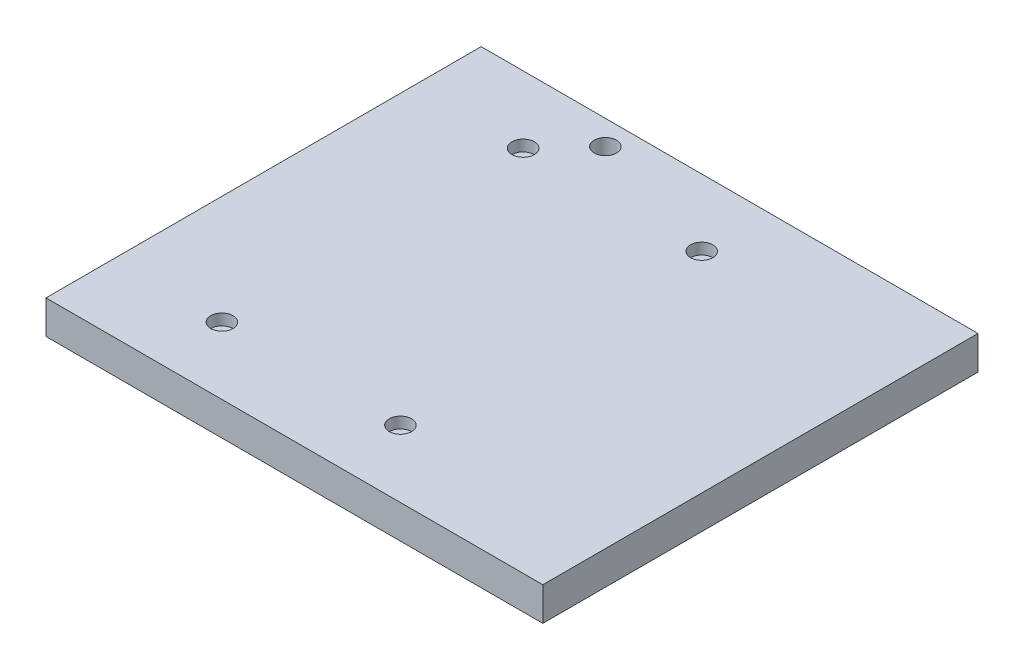
ISO-10303-21;
HEADER;
FILE_DESCRIPTION(('STEP AP214'),'2;1');
FILE_NAME('part.step','',(''),(''),'','','');
FILE_SCHEMA(('AUTOMOTIVE_DESIGN { 1 0 10303 214 1 1 1 1 }'));
ENDSEC;
DATA;
#1=APPLICATION_CONTEXT('core data for automotive mechanical design processes');
#2=APPLICATION_PROTOCOL_DEFINITION('international standard','automotive_design',2000,#1);
#3=PRODUCT_CONTEXT('',#1,'mechanical');
#4=PRODUCT('Part','Part','',(#3));
#5=PRODUCT_RELATED_PRODUCT_CATEGORY('part','',(#4));
#6=PRODUCT_DEFINITION_FORMATION('','',#4);
#7=PRODUCT_DEFINITION_CONTEXT('part definition',#1,'design');
#8=PRODUCT_DEFINITION('design','',#6,#7);
#9=PRODUCT_DEFINITION_SHAPE('','',#8);
#10=(LENGTH_UNIT() NAMED_UNIT(*) SI_UNIT(.MILLI.,.METRE.));
#11=(NAMED_UNIT(*) PLANE_ANGLE_UNIT() SI_UNIT($,.RADIAN.));
#12=(NAMED_UNIT(*) SI_UNIT($,.STERADIAN.) SOLID_ANGLE_UNIT());
#13=UNCERTAINTY_MEASURE_WITH_UNIT(LENGTH_MEASURE(1.E-05),#10,'distance_accuracy_value','');
#14=(GEOMETRIC_REPRESENTATION_CONTEXT(3) GLOBAL_UNCERTAINTY_ASSIGNED_CONTEXT((#13)) GLOBAL_UNIT_ASSIGNED_CONTEXT((#10,
#11,#12)) REPRESENTATION_CONTEXT('',''));
#15=CARTESIAN_POINT('',(0.,0.,0.));
#16=DIRECTION('',(0.,0.,1.));
#17=DIRECTION('',(1.,0.,0.));
#18=AXIS2_PLACEMENT_3D('',#15,#16,#17);
#19=CARTESIAN_POINT('',(0.,30.,0.));
#20=DIRECTION('',(1.,0.,0.));
#21=DIRECTION('',(0.,0.,-1.));
#22=AXIS2_PLACEMENT_3D('',#19,#20,#21);
#23=PLANE('',#22);
#24=DIRECTION('',(0.,0.,1.));
#25=VECTOR('',#24,1.);
#26=CARTESIAN_POINT('',(0.,0.,0.));
#27=LINE('',#26,#25);
#28=CARTESIAN_POINT('',(0.,0.,0.));
#29=VERTEX_POINT('',#28);
#30=CARTESIAN_POINT('',(0.,0.,390.));
#31=VERTEX_POINT('',#30);
#32=EDGE_CURVE('E95',#29,#31,#27,.T.);
#33=ORIENTED_EDGE('',*,*,#32,.T.);
#34=DIRECTION('',(0.,-1.,0.));
#35=VECTOR('',#34,1.);
#36=CARTESIAN_POINT('',(0.,30.,390.));
#37=LINE('',#36,#35);
#38=CARTESIAN_POINT('',(0.,30.,390.));
#39=VERTEX_POINT('',#38);
#40=EDGE_CURVE('E11',#39,#31,#37,.T.);
#41=ORIENTED_EDGE('',*,*,#40,.F.);
#42=DIRECTION('',(0.,0.,1.));
#43=VECTOR('',#42,1.);
#44=CARTESIAN_POINT('',(0.,30.,0.));
#45=LINE('',#44,#43);
#46=CARTESIAN_POINT('',(0.,30.,0.));
#47=VERTEX_POINT('',#46);
#48=EDGE_CURVE('E89',#47,#39,#45,.T.);
#49=ORIENTED_EDGE('',*,*,#48,.F.);
#50=DIRECTION('',(0.,-1.,0.));
#51=VECTOR('',#50,1.);
#52=CARTESIAN_POINT('',(0.,30.,0.));
#53=LINE('',#52,#51);
#54=EDGE_CURVE('E48',#47,#29,#53,.T.);
#55=ORIENTED_EDGE('',*,*,#54,.T.);
#56=EDGE_LOOP('',(#33,#41,#49,#55));
#57=FACE_BOUND('',#56,.T.);
#58=ADVANCED_FACE('F40',(#57),#23,.F.);
#59=CARTESIAN_POINT('',(0.,30.,390.));
#60=DIRECTION('',(0.,0.,-1.));
#61=DIRECTION('',(-1.,0.,0.));
#62=AXIS2_PLACEMENT_3D('',#59,#60,#61);
#63=PLANE('',#62);
#64=DIRECTION('',(1.,0.,0.));
#65=VECTOR('',#64,1.);
#66=CARTESIAN_POINT('',(0.,0.,390.));
#67=LINE('',#66,#65);
#68=CARTESIAN_POINT('',(445.26,0.,390.));
#69=VERTEX_POINT('',#68);
#70=EDGE_CURVE('E90',#31,#69,#67,.T.);
#71=ORIENTED_EDGE('',*,*,#70,.T.);
#72=DIRECTION('',(0.,-1.,0.));
#73=VECTOR('',#72,1.);
#74=CARTESIAN_POINT('',(445.26,30.,390.));
#75=LINE('',#74,#73);
#76=CARTESIAN_POINT('',(445.26,30.,390.));
#77=VERTEX_POINT('',#76);
#78=EDGE_CURVE('E113',#77,#69,#75,.T.);
#79=ORIENTED_EDGE('',*,*,#78,.F.);
#80=DIRECTION('',(1.,0.,0.));
#81=VECTOR('',#80,1.);
#82=CARTESIAN_POINT('',(0.,30.,390.));
#83=LINE('',#82,#81);
#84=EDGE_CURVE('E106',#39,#77,#83,.T.);
#85=ORIENTED_EDGE('',*,*,#84,.F.);
#86=ORIENTED_EDGE('',*,*,#40,.T.);
#87=EDGE_LOOP('',(#71,#79,#85,#86));
#88=FACE_BOUND('',#87,.T.);
#89=ADVANCED_FACE('F191',(#88),#63,.F.);
#90=CARTESIAN_POINT('',(0.,30.,0.));
#91=DIRECTION('',(0.,0.,1.));
#92=DIRECTION('',(1.,0.,0.));
#93=AXIS2_PLACEMENT_3D('',#90,#91,#92);
#94=PLANE('',#93);
#95=DIRECTION('',(-1.,0.,0.));
#96=VECTOR('',#95,1.);
#97=CARTESIAN_POINT('',(0.,0.,0.));
#98=LINE('',#97,#96);
#99=CARTESIAN_POINT('',(445.26,0.,0.));
#100=VERTEX_POINT('',#99);
#101=EDGE_CURVE('E78',#100,#29,#98,.T.);
#102=ORIENTED_EDGE('',*,*,#101,.T.);
#103=ORIENTED_EDGE('',*,*,#54,.F.);
#104=DIRECTION('',(-1.,0.,0.));
#105=VECTOR('',#104,1.);
#106=CARTESIAN_POINT('',(0.,30.,0.));
#107=LINE('',#106,#105);
#108=CARTESIAN_POINT('',(445.26,30.,0.));
#109=VERTEX_POINT('',#108);
#110=EDGE_CURVE('E64',#109,#47,#107,.T.);
#111=ORIENTED_EDGE('',*,*,#110,.F.);
#112=DIRECTION('',(0.,1.,0.));
#113=VECTOR('',#112,1.);
#114=CARTESIAN_POINT('',(445.26,30.,0.));
#115=LINE('',#114,#113);
#116=EDGE_CURVE('E84',#100,#109,#115,.T.);
#117=ORIENTED_EDGE('',*,*,#116,.F.);
#118=EDGE_LOOP('',(#102,#103,#111,#117));
#119=FACE_BOUND('',#118,.T.);
#120=ADVANCED_FACE('F80',(#119),#94,.F.);
#121=CARTESIAN_POINT('',(0.,30.,0.));
#122=DIRECTION('',(0.,1.,0.));
#123=DIRECTION('',(0.,0.,1.));
#124=AXIS2_PLACEMENT_3D('',#121,#122,#123);
#125=PLANE('',#124);
#126=CARTESIAN_POINT('',(133.244825988811,30.,21.9404101029603));
#127=DIRECTION('',(0.,1.,0.));
#128=DIRECTION('',(0.,0.,1.));
#129=AXIS2_PLACEMENT_3D('',#126,#127,#128);
#130=CIRCLE('',#129,10.);
#131=CARTESIAN_POINT('',(133.244825988811,30.,31.9404101029603));
#132=VERTEX_POINT('',#131);
#133=EDGE_CURVE('E172',#132,#132,#130,.T.);
#134=ORIENTED_EDGE('',*,*,#133,.F.);
#135=EDGE_LOOP('',(#134));
#136=FACE_BOUND('',#135,.T.);
#137=CARTESIAN_POINT('',(97.63,30.,330.));
#138=DIRECTION('',(0.,-1.,0.));
#139=DIRECTION('',(0.,0.,-1.));
#140=AXIS2_PLACEMENT_3D('',#137,#138,#139);
#141=CIRCLE('',#140,10.);
#142=CARTESIAN_POINT('',(97.63,30.,320.));
#143=VERTEX_POINT('',#142);
#144=EDGE_CURVE('E135',#143,#143,#141,.T.);
#145=ORIENTED_EDGE('',*,*,#144,.T.);
#146=EDGE_LOOP('',(#145));
#147=FACE_BOUND('',#146,.T.);
#148=CARTESIAN_POINT('',(257.63,30.,330.));
#149=DIRECTION('',(0.,1.,0.));
#150=DIRECTION('',(0.,0.,-1.));
#151=AXIS2_PLACEMENT_3D('',#148,#149,#150);
#152=CIRCLE('',#151,10.);
#153=CARTESIAN_POINT('',(257.63,30.,320.));
#154=VERTEX_POINT('',#153);
#155=EDGE_CURVE('E129',#154,#154,#152,.T.);
#156=ORIENTED_EDGE('',*,*,#155,.F.);
#157=EDGE_LOOP('',(#156));
#158=FACE_BOUND('',#157,.T.);
#159=CARTESIAN_POINT('',(257.63,30.,60.));
#160=DIRECTION('',(0.,-1.,0.));
#161=DIRECTION('',(0.,0.,1.));
#162=AXIS2_PLACEMENT_3D('',#159,#160,#161);
#163=CIRCLE('',#162,10.);
#164=CARTESIAN_POINT('',(257.63,30.,70.));
#165=VERTEX_POINT('',#164);
#166=EDGE_CURVE('E123',#165,#165,#163,.T.);
#167=ORIENTED_EDGE('',*,*,#166,.T.);
#168=EDGE_LOOP('',(#167));
#169=FACE_BOUND('',#168,.T.);
#170=CARTESIAN_POINT('',(97.63,30.,60.));
#171=DIRECTION('',(0.,1.,0.));
#172=DIRECTION('',(0.,0.,1.));
#173=AXIS2_PLACEMENT_3D('',#170,#171,#172);
#174=CIRCLE('',#173,10.);
#175=CARTESIAN_POINT('',(97.63,30.,70.));
#176=VERTEX_POINT('',#175);
#177=EDGE_CURVE('E117',#176,#176,#174,.T.);
#178=ORIENTED_EDGE('',*,*,#177,.F.);
#179=EDGE_LOOP('',(#178));
#180=FACE_BOUND('',#179,.T.);
#181=ORIENTED_EDGE('',*,*,#48,.T.);
#182=ORIENTED_EDGE('',*,*,#84,.T.);
#183=DIRECTION('',(0.,0.,1.));
#184=VECTOR('',#183,1.);
#185=CARTESIAN_POINT('',(445.26,30.,390.));
#186=LINE('',#185,#184);
#187=EDGE_CURVE('E99',#109,#77,#186,.T.);
#188=ORIENTED_EDGE('',*,*,#187,.F.);
#189=ORIENTED_EDGE('',*,*,#110,.T.);
#190=EDGE_LOOP('',(#181,#182,#188,#189));
#191=FACE_BOUND('',#190,.T.);
#192=ADVANCED_FACE('F199',(#136,#147,#158,#169,#180,#191),#125,.T.);
#193=CARTESIAN_POINT('',(0.,0.,0.));
#194=DIRECTION('',(0.,1.,0.));
#195=DIRECTION('',(0.,0.,1.));
#196=AXIS2_PLACEMENT_3D('',#193,#194,#195);
#197=PLANE('',#196);
#198=DIRECTION('',(1.,0.,0.));
#199=VECTOR('',#198,1.);
#200=CARTESIAN_POINT('',(355.26,0.,10.0000000000001));
#201=LINE('',#200,#199);
#202=CARTESIAN_POINT('',(20.0000000000001,0.,10.));
#203=VERTEX_POINT('',#202);
#204=CARTESIAN_POINT('',(355.26,0.,10.0000000000001));
#205=VERTEX_POINT('',#204);
#206=EDGE_CURVE('E158',#203,#205,#201,.T.);
#207=ORIENTED_EDGE('',*,*,#206,.F.);
#208=DIRECTION('',(0.,0.,-1.));
#209=VECTOR('',#208,1.);
#210=CARTESIAN_POINT('',(20.,0.,380.));
#211=LINE('',#210,#209);
#212=CARTESIAN_POINT('',(20.,0.,380.));
#213=VERTEX_POINT('',#212);
#214=EDGE_CURVE('E55',#213,#203,#211,.T.);
#215=ORIENTED_EDGE('',*,*,#214,.F.);
#216=DIRECTION('',(-1.,0.,0.));
#217=VECTOR('',#216,1.);
#218=CARTESIAN_POINT('',(355.26,0.,380.));
#219=LINE('',#218,#217);
#220=CARTESIAN_POINT('',(355.26,0.,380.));
#221=VERTEX_POINT('',#220);
#222=EDGE_CURVE('E151',#221,#213,#219,.T.);
#223=ORIENTED_EDGE('',*,*,#222,.F.);
#224=DIRECTION('',(0.,0.,1.));
#225=VECTOR('',#224,1.);
#226=CARTESIAN_POINT('',(355.26,0.,380.));
#227=LINE('',#226,#225);
#228=EDGE_CURVE('E155',#205,#221,#227,.T.);
#229=ORIENTED_EDGE('',*,*,#228,.F.);
#230=EDGE_LOOP('',(#207,#215,#223,#229));
#231=FACE_BOUND('',#230,.T.);
#232=ORIENTED_EDGE('',*,*,#32,.F.);
#233=ORIENTED_EDGE('',*,*,#101,.F.);
#234=DIRECTION('',(0.,0.,-1.));
#235=VECTOR('',#234,1.);
#236=CARTESIAN_POINT('',(445.26,0.,390.));
#237=LINE('',#236,#235);
#238=EDGE_CURVE('E111',#69,#100,#237,.T.);
#239=ORIENTED_EDGE('',*,*,#238,.F.);
#240=ORIENTED_EDGE('',*,*,#70,.F.);
#241=EDGE_LOOP('',(#232,#233,#239,#240));
#242=FACE_BOUND('',#241,.T.);
#243=ADVANCED_FACE('F97',(#231,#242),#197,.F.);
#244=CARTESIAN_POINT('',(445.26,0.,0.));
#245=DIRECTION('',(1.,0.,0.));
#246=DIRECTION('',(0.,0.,-1.));
#247=AXIS2_PLACEMENT_3D('',#244,#245,#246);
#248=PLANE('',#247);
#249=ORIENTED_EDGE('',*,*,#78,.T.);
#250=ORIENTED_EDGE('',*,*,#238,.T.);
#251=ORIENTED_EDGE('',*,*,#116,.T.);
#252=ORIENTED_EDGE('',*,*,#187,.T.);
#253=EDGE_LOOP('',(#249,#250,#251,#252));
#254=FACE_BOUND('',#253,.T.);
#255=ADVANCED_FACE('F204',(#254),#248,.T.);
#256=CARTESIAN_POINT('',(97.63,20.,60.));
#257=DIRECTION('',(0.,1.,0.));
#258=DIRECTION('',(0.,0.,1.));
#259=AXIS2_PLACEMENT_3D('',#256,#257,#258);
#260=CYLINDRICAL_SURFACE('',#259,10.);
#261=CARTESIAN_POINT('',(97.63,20.,60.));
#262=DIRECTION('',(0.,1.,0.));
#263=DIRECTION('',(0.,0.,1.));
#264=AXIS2_PLACEMENT_3D('',#261,#262,#263);
#265=CIRCLE('',#264,10.);
#266=CARTESIAN_POINT('',(97.63,20.,70.));
#267=VERTEX_POINT('',#266);
#268=EDGE_CURVE('E116',#267,#267,#265,.T.);
#269=ORIENTED_EDGE('',*,*,#268,.F.);
#270=EDGE_LOOP('',(#269));
#271=FACE_BOUND('',#270,.T.);
#272=ORIENTED_EDGE('',*,*,#177,.T.);
#273=EDGE_LOOP('',(#272));
#274=FACE_BOUND('',#273,.T.);
#275=ADVANCED_FACE('F211',(#271,#274),#260,.F.);
#276=CARTESIAN_POINT('',(97.63,20.,60.));
#277=DIRECTION('',(0.,1.,0.));
#278=DIRECTION('',(0.,0.,1.));
#279=AXIS2_PLACEMENT_3D('',#276,#277,#278);
#280=PLANE('',#279);
#281=ORIENTED_EDGE('',*,*,#268,.T.);
#282=EDGE_LOOP('',(#281));
#283=FACE_BOUND('',#282,.T.);
#284=ADVANCED_FACE('F215',(#283),#280,.T.);
#285=CARTESIAN_POINT('',(257.63,20.,60.));
#286=DIRECTION('',(0.,1.,0.));
#287=DIRECTION('',(0.,0.,1.));
#288=AXIS2_PLACEMENT_3D('',#285,#286,#287);
#289=CYLINDRICAL_SURFACE('',#288,10.);
#290=CARTESIAN_POINT('',(257.63,20.,60.));
#291=DIRECTION('',(0.,-1.,0.));
#292=DIRECTION('',(0.,0.,1.));
#293=AXIS2_PLACEMENT_3D('',#290,#291,#292);
#294=CIRCLE('',#293,10.);
#295=CARTESIAN_POINT('',(257.63,20.,70.));
#296=VERTEX_POINT('',#295);
#297=EDGE_CURVE('E120',#296,#296,#294,.T.);
#298=ORIENTED_EDGE('',*,*,#297,.T.);
#299=EDGE_LOOP('',(#298));
#300=FACE_BOUND('',#299,.T.);
#301=ORIENTED_EDGE('',*,*,#166,.F.);
#302=EDGE_LOOP('',(#301));
#303=FACE_BOUND('',#302,.T.);
#304=ADVANCED_FACE('F219',(#300,#303),#289,.F.);
#305=CARTESIAN_POINT('',(257.63,20.,60.));
#306=DIRECTION('',(0.,1.,0.));
#307=DIRECTION('',(0.,0.,1.));
#308=AXIS2_PLACEMENT_3D('',#305,#306,#307);
#309=PLANE('',#308);
#310=ORIENTED_EDGE('',*,*,#297,.F.);
#311=EDGE_LOOP('',(#310));
#312=FACE_BOUND('',#311,.T.);
#313=ADVANCED_FACE('F223',(#312),#309,.T.);
#314=CARTESIAN_POINT('',(257.63,20.,330.));
#315=DIRECTION('',(0.,1.,0.));
#316=DIRECTION('',(0.,0.,1.));
#317=AXIS2_PLACEMENT_3D('',#314,#315,#316);
#318=CYLINDRICAL_SURFACE('',#317,10.);
#319=CARTESIAN_POINT('',(257.63,20.,330.));
#320=DIRECTION('',(0.,1.,0.));
#321=DIRECTION('',(0.,0.,-1.));
#322=AXIS2_PLACEMENT_3D('',#319,#320,#321);
#323=CIRCLE('',#322,10.);
#324=CARTESIAN_POINT('',(257.63,20.,320.));
#325=VERTEX_POINT('',#324);
#326=EDGE_CURVE('E126',#325,#325,#323,.T.);
#327=ORIENTED_EDGE('',*,*,#326,.F.);
#328=EDGE_LOOP('',(#327));
#329=FACE_BOUND('',#328,.T.);
#330=ORIENTED_EDGE('',*,*,#155,.T.);
#331=EDGE_LOOP('',(#330));
#332=FACE_BOUND('',#331,.T.);
#333=ADVANCED_FACE('F227',(#329,#332),#318,.F.);
#334=CARTESIAN_POINT('',(257.63,20.,330.));
#335=DIRECTION('',(0.,1.,0.));
#336=DIRECTION('',(0.,0.,-1.));
#337=AXIS2_PLACEMENT_3D('',#334,#335,#336);
#338=PLANE('',#337);
#339=ORIENTED_EDGE('',*,*,#326,.T.);
#340=EDGE_LOOP('',(#339));
#341=FACE_BOUND('',#340,.T.);
#342=ADVANCED_FACE('F231',(#341),#338,.T.);
#343=CARTESIAN_POINT('',(97.63,20.,330.));
#344=DIRECTION('',(0.,1.,0.));
#345=DIRECTION('',(0.,0.,1.));
#346=AXIS2_PLACEMENT_3D('',#343,#344,#345);
#347=CYLINDRICAL_SURFACE('',#346,10.);
#348=CARTESIAN_POINT('',(97.63,20.,330.));
#349=DIRECTION('',(0.,-1.,0.));
#350=DIRECTION('',(0.,0.,-1.));
#351=AXIS2_PLACEMENT_3D('',#348,#349,#350);
#352=CIRCLE('',#351,10.);
#353=CARTESIAN_POINT('',(97.63,20.,320.));
#354=VERTEX_POINT('',#353);
#355=EDGE_CURVE('E132',#354,#354,#352,.T.);
#356=ORIENTED_EDGE('',*,*,#355,.T.);
#357=EDGE_LOOP('',(#356));
#358=FACE_BOUND('',#357,.T.);
#359=ORIENTED_EDGE('',*,*,#144,.F.);
#360=EDGE_LOOP('',(#359));
#361=FACE_BOUND('',#360,.T.);
#362=ADVANCED_FACE('F235',(#358,#361),#347,.F.);
#363=CARTESIAN_POINT('',(97.63,20.,330.));
#364=DIRECTION('',(0.,1.,0.));
#365=DIRECTION('',(0.,0.,-1.));
#366=AXIS2_PLACEMENT_3D('',#363,#364,#365);
#367=PLANE('',#366);
#368=ORIENTED_EDGE('',*,*,#355,.F.);
#369=EDGE_LOOP('',(#368));
#370=FACE_BOUND('',#369,.T.);
#371=ADVANCED_FACE('F239',(#370),#367,.T.);
#372=CARTESIAN_POINT('',(20.,10.,380.));
#373=DIRECTION('',(-1.,0.,0.));
#374=DIRECTION('',(0.,0.,1.));
#375=AXIS2_PLACEMENT_3D('',#372,#373,#374);
#376=PLANE('',#375);
#377=ORIENTED_EDGE('',*,*,#214,.T.);
#378=DIRECTION('',(0.,-1.,0.));
#379=VECTOR('',#378,1.);
#380=CARTESIAN_POINT('',(20.0000000000001,10.,10.));
#381=LINE('',#380,#379);
#382=CARTESIAN_POINT('',(20.0000000000001,10.,10.));
#383=VERTEX_POINT('',#382);
#384=EDGE_CURVE('E141',#383,#203,#381,.T.);
#385=ORIENTED_EDGE('',*,*,#384,.F.);
#386=DIRECTION('',(0.,0.,-1.));
#387=VECTOR('',#386,1.);
#388=CARTESIAN_POINT('',(20.,10.,380.));
#389=LINE('',#388,#387);
#390=CARTESIAN_POINT('',(20.,10.,380.));
#391=VERTEX_POINT('',#390);
#392=EDGE_CURVE('E154',#391,#383,#389,.T.);
#393=ORIENTED_EDGE('',*,*,#392,.F.);
#394=DIRECTION('',(0.,-1.,0.));
#395=VECTOR('',#394,1.);
#396=CARTESIAN_POINT('',(20.,10.,380.));
#397=LINE('',#396,#395);
#398=EDGE_CURVE('E138',#391,#213,#397,.T.);
#399=ORIENTED_EDGE('',*,*,#398,.T.);
#400=EDGE_LOOP('',(#377,#385,#393,#399));
#401=FACE_BOUND('',#400,.T.);
#402=ADVANCED_FACE('F243',(#401),#376,.F.);
#403=CARTESIAN_POINT('',(355.26,10.,380.));
#404=DIRECTION('',(0.,0.,1.));
#405=DIRECTION('',(1.,0.,0.));
#406=AXIS2_PLACEMENT_3D('',#403,#404,#405);
#407=PLANE('',#406);
#408=ORIENTED_EDGE('',*,*,#222,.T.);
#409=ORIENTED_EDGE('',*,*,#398,.F.);
#410=DIRECTION('',(-1.,0.,0.));
#411=VECTOR('',#410,1.);
#412=CARTESIAN_POINT('',(355.26,10.,380.));
#413=LINE('',#412,#411);
#414=CARTESIAN_POINT('',(355.26,10.,380.));
#415=VERTEX_POINT('',#414);
#416=EDGE_CURVE('E144',#415,#391,#413,.T.);
#417=ORIENTED_EDGE('',*,*,#416,.F.);
#418=DIRECTION('',(0.,-1.,0.));
#419=VECTOR('',#418,1.);
#420=CARTESIAN_POINT('',(355.26,10.,380.));
#421=LINE('',#420,#419);
#422=EDGE_CURVE('E147',#415,#221,#421,.T.);
#423=ORIENTED_EDGE('',*,*,#422,.T.);
#424=EDGE_LOOP('',(#408,#409,#417,#423));
#425=FACE_BOUND('',#424,.T.);
#426=ADVANCED_FACE('F247',(#425),#407,.F.);
#427=CARTESIAN_POINT('',(355.26,10.,380.));
#428=DIRECTION('',(1.,0.,0.));
#429=DIRECTION('',(0.,0.,-1.));
#430=AXIS2_PLACEMENT_3D('',#427,#428,#429);
#431=PLANE('',#430);
#432=ORIENTED_EDGE('',*,*,#228,.T.);
#433=ORIENTED_EDGE('',*,*,#422,.F.);
#434=DIRECTION('',(0.,0.,1.));
#435=VECTOR('',#434,1.);
#436=CARTESIAN_POINT('',(355.26,10.,380.));
#437=LINE('',#436,#435);
#438=CARTESIAN_POINT('',(355.26,10.,10.0000000000001));
#439=VERTEX_POINT('',#438);
#440=EDGE_CURVE('E164',#439,#415,#437,.T.);
#441=ORIENTED_EDGE('',*,*,#440,.F.);
#442=DIRECTION('',(0.,-1.,0.));
#443=VECTOR('',#442,1.);
#444=CARTESIAN_POINT('',(355.26,10.,10.0000000000001));
#445=LINE('',#444,#443);
#446=EDGE_CURVE('E143',#439,#205,#445,.T.);
#447=ORIENTED_EDGE('',*,*,#446,.T.);
#448=EDGE_LOOP('',(#432,#433,#441,#447));
#449=FACE_BOUND('',#448,.T.);
#450=ADVANCED_FACE('F250',(#449),#431,.F.);
#451=CARTESIAN_POINT('',(355.26,10.,10.0000000000001));
#452=DIRECTION('',(0.,0.,-1.));
#453=DIRECTION('',(-1.,0.,0.));
#454=AXIS2_PLACEMENT_3D('',#451,#452,#453);
#455=PLANE('',#454);
#456=ORIENTED_EDGE('',*,*,#206,.T.);
#457=ORIENTED_EDGE('',*,*,#446,.F.);
#458=DIRECTION('',(1.,0.,0.));
#459=VECTOR('',#458,1.);
#460=CARTESIAN_POINT('',(355.26,10.,10.0000000000001));
#461=LINE('',#460,#459);
#462=EDGE_CURVE('E167',#383,#439,#461,.T.);
#463=ORIENTED_EDGE('',*,*,#462,.F.);
#464=ORIENTED_EDGE('',*,*,#384,.T.);
#465=EDGE_LOOP('',(#456,#457,#463,#464));
#466=FACE_BOUND('',#465,.T.);
#467=ADVANCED_FACE('F188',(#466),#455,.F.);
#468=CARTESIAN_POINT('',(0.,10.,0.));
#469=DIRECTION('',(0.,1.,0.));
#470=DIRECTION('',(0.,0.,1.));
#471=AXIS2_PLACEMENT_3D('',#468,#469,#470);
#472=PLANE('',#471);
#473=CARTESIAN_POINT('',(133.244825988811,9.99999999999999,21.9404101029603));
#474=DIRECTION('',(0.,1.,0.));
#475=DIRECTION('',(0.,0.,1.));
#476=AXIS2_PLACEMENT_3D('',#473,#474,#475);
#477=CIRCLE('',#476,10.);
#478=CARTESIAN_POINT('',(133.244825988811,9.99999999999999,31.9404101029603));
#479=VERTEX_POINT('',#478);
#480=EDGE_CURVE('E43',#479,#479,#477,.T.);
#481=ORIENTED_EDGE('',*,*,#480,.T.);
#482=EDGE_LOOP('',(#481));
#483=FACE_BOUND('',#482,.T.);
#484=ORIENTED_EDGE('',*,*,#392,.T.);
#485=ORIENTED_EDGE('',*,*,#462,.T.);
#486=ORIENTED_EDGE('',*,*,#440,.T.);
#487=ORIENTED_EDGE('',*,*,#416,.T.);
#488=EDGE_LOOP('',(#484,#485,#486,#487));
#489=FACE_BOUND('',#488,.T.);
#490=ADVANCED_FACE('F179',(#483,#489),#472,.F.);
#491=CARTESIAN_POINT('',(133.244825988811,-57.,21.9404101029603));
#492=DIRECTION('',(0.,1.,0.));
#493=DIRECTION('',(0.,0.,1.));
#494=AXIS2_PLACEMENT_3D('',#491,#492,#493);
#495=CYLINDRICAL_SURFACE('',#494,10.);
#496=ORIENTED_EDGE('',*,*,#133,.T.);
#497=EDGE_LOOP('',(#496));
#498=FACE_BOUND('',#497,.T.);
#499=ORIENTED_EDGE('',*,*,#480,.F.);
#500=EDGE_LOOP('',(#499));
#501=FACE_BOUND('',#500,.T.);
#502=ADVANCED_FACE('F182',(#498,#501),#495,.F.);
#503=CLOSED_SHELL('',(#58,#89,#120,#192,#243,#255,#275,#284,#304,#313,#333,#342,#362,#371,#402,
#426,#450,#467,#490,#502));
#504=MANIFOLD_SOLID_BREP('B2',#503);
#505=ADVANCED_BREP_SHAPE_REPRESENTATION('',(#18,#504),#14);
#506=SHAPE_DEFINITION_REPRESENTATION(#9,#505);
ENDSEC;
END-ISO-10303-21;
